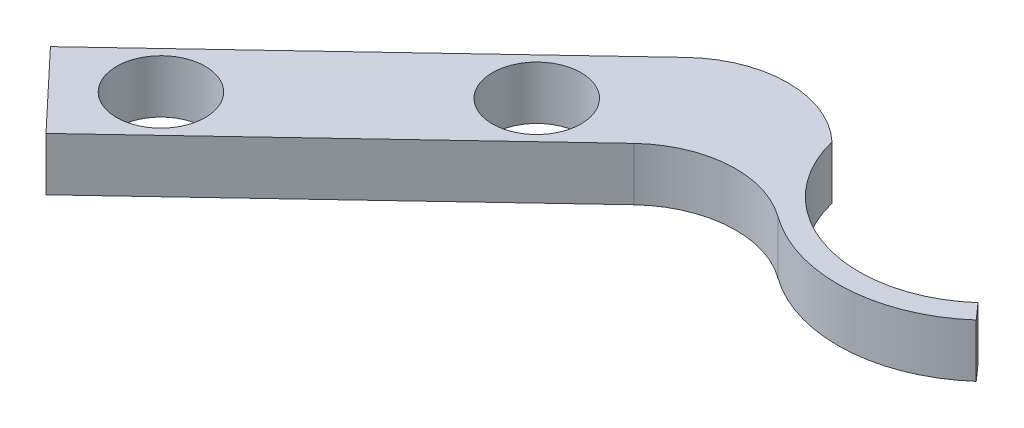
ISO-10303-21;
HEADER;
FILE_DESCRIPTION(('STEP AP214'),'2;1');
FILE_NAME('part.step','',(''),(''),'','','');
FILE_SCHEMA(('AUTOMOTIVE_DESIGN { 1 0 10303 214 1 1 1 1 }'));
ENDSEC;
DATA;
#1=APPLICATION_CONTEXT('core data for automotive mechanical design processes');
#2=APPLICATION_PROTOCOL_DEFINITION('international standard','automotive_design',2000,#1);
#3=PRODUCT_CONTEXT('',#1,'mechanical');
#4=PRODUCT('Part','Part','',(#3));
#5=PRODUCT_RELATED_PRODUCT_CATEGORY('part','',(#4));
#6=PRODUCT_DEFINITION_FORMATION('','',#4);
#7=PRODUCT_DEFINITION_CONTEXT('part definition',#1,'design');
#8=PRODUCT_DEFINITION('design','',#6,#7);
#9=PRODUCT_DEFINITION_SHAPE('','',#8);
#10=(LENGTH_UNIT() NAMED_UNIT(*) SI_UNIT(.MILLI.,.METRE.));
#11=(NAMED_UNIT(*) PLANE_ANGLE_UNIT() SI_UNIT($,.RADIAN.));
#12=(NAMED_UNIT(*) SI_UNIT($,.STERADIAN.) SOLID_ANGLE_UNIT());
#13=UNCERTAINTY_MEASURE_WITH_UNIT(LENGTH_MEASURE(1.E-05),#10,'distance_accuracy_value','');
#14=(GEOMETRIC_REPRESENTATION_CONTEXT(3) GLOBAL_UNCERTAINTY_ASSIGNED_CONTEXT((#13)) GLOBAL_UNIT_ASSIGNED_CONTEXT((#10,
#11,#12)) REPRESENTATION_CONTEXT('',''));
#15=CARTESIAN_POINT('',(0.,0.,0.));
#16=DIRECTION('',(0.,0.,1.));
#17=DIRECTION('',(1.,0.,0.));
#18=AXIS2_PLACEMENT_3D('',#15,#16,#17);
#19=CARTESIAN_POINT('',(-18.1068328298578,5.,17.0745135447983));
#20=DIRECTION('',(0.727542136032065,0.,-0.686063000239702));
#21=DIRECTION('',(-0.686063000239702,0.,-0.727542136032065));
#22=AXIS2_PLACEMENT_3D('',#19,#20,#21);
#23=PLANE('',#22);
#24=DIRECTION('',(0.686063000239702,0.,0.727542136032065));
#25=VECTOR('',#24,1.);
#26=CARTESIAN_POINT('',(-18.1068328298578,5.,17.0745135447983));
#27=LINE('',#26,#25);
#28=CARTESIAN_POINT('',(-14.6765178286592,5.,20.7122242249587));
#29=VERTEX_POINT('',#28);
#30=CARTESIAN_POINT('',(-7.8158878262622,5.,27.9876455852793));
#31=VERTEX_POINT('',#30);
#32=EDGE_CURVE('E125',#29,#31,#27,.T.);
#33=ORIENTED_EDGE('',*,*,#32,.F.);
#34=DIRECTION('',(0.,1.,0.));
#35=VECTOR('',#34,1.);
#36=CARTESIAN_POINT('',(-14.6765178286592,0.,20.7122242249587));
#37=LINE('',#36,#35);
#38=CARTESIAN_POINT('',(-14.6765178286592,0.,20.7122242249587));
#39=VERTEX_POINT('',#38);
#40=EDGE_CURVE('E110',#39,#29,#37,.T.);
#41=ORIENTED_EDGE('',*,*,#40,.F.);
#42=DIRECTION('',(0.686063000239702,0.,0.727542136032065));
#43=VECTOR('',#42,1.);
#44=CARTESIAN_POINT('',(-18.1068328298578,0.,17.0745135447983));
#45=LINE('',#44,#43);
#46=CARTESIAN_POINT('',(-7.8158878262622,0.,27.9876455852793));
#47=VERTEX_POINT('',#46);
#48=EDGE_CURVE('E122',#39,#47,#45,.T.);
#49=ORIENTED_EDGE('',*,*,#48,.T.);
#50=DIRECTION('',(0.,-1.,0.));
#51=VECTOR('',#50,1.);
#52=CARTESIAN_POINT('',(-7.8158878262622,5.,27.9876455852793));
#53=LINE('',#52,#51);
#54=EDGE_CURVE('E133',#31,#47,#53,.T.);
#55=ORIENTED_EDGE('',*,*,#54,.F.);
#56=EDGE_LOOP('',(#33,#41,#49,#55));
#57=FACE_BOUND('',#56,.T.);
#58=ADVANCED_FACE('F41',(#57),#23,.F.);
#59=CARTESIAN_POINT('',(0.,5.,0.));
#60=DIRECTION('',(0.,1.,0.));
#61=DIRECTION('',(0.,0.,1.));
#62=AXIS2_PLACEMENT_3D('',#59,#60,#61);
#63=PLANE('',#62);
#64=CARTESIAN_POINT('',(41.6849024656537,5.,-11.1706048980363));
#65=DIRECTION('',(0.,-1.,0.));
#66=DIRECTION('',(-0.998279481293919,0.,-0.0586351194041914));
#67=AXIS2_PLACEMENT_3D('',#64,#65,#66);
#68=CIRCLE('',#67,12.1999999999932);
#69=CARTESIAN_POINT('',(49.7909350480435,5.,-2.05291682632269));
#70=VERTEX_POINT('',#69);
#71=CARTESIAN_POINT('',(29.8309378284776,5.,-8.28555335943157));
#72=VERTEX_POINT('',#71);
#73=EDGE_CURVE('E182',#70,#72,#68,.T.);
#74=ORIENTED_EDGE('',*,*,#73,.T.);
#75=CARTESIAN_POINT('',(22.9527180289293,5.,-1.02675921790221));
#76=DIRECTION('',(0.,1.,0.));
#77=DIRECTION('',(0.,0.,1.));
#78=AXIS2_PLACEMENT_3D('',#75,#76,#77);
#79=CIRCLE('',#78,10.);
#80=CARTESIAN_POINT('',(16.0920880265322,5.,-8.30218057822283));
#81=VERTEX_POINT('',#80);
#82=EDGE_CURVE('E57',#72,#81,#79,.T.);
#83=ORIENTED_EDGE('',*,*,#82,.T.);
#84=DIRECTION('',(-0.727542136032062,0.,0.686063000239704));
#85=VECTOR('',#84,1.);
#86=CARTESIAN_POINT('',(3.43031500119851,5.,3.6377106801603));
#87=LINE('',#86,#85);
#88=EDGE_CURVE('E184',#81,#29,#87,.T.);
#89=ORIENTED_EDGE('',*,*,#88,.T.);
#90=ORIENTED_EDGE('',*,*,#32,.T.);
#91=DIRECTION('',(-0.727542136032062,0.,0.686063000239705));
#92=VECTOR('',#91,1.);
#93=CARTESIAN_POINT('',(10.2909450035955,5.,10.9131320404809));
#94=LINE('',#93,#92);
#95=CARTESIAN_POINT('',(20.6356951478936,5.,1.15816395102519));
#96=VERTEX_POINT('',#95);
#97=EDGE_CURVE('E173',#96,#31,#94,.T.);
#98=ORIENTED_EDGE('',*,*,#97,.F.);
#99=CARTESIAN_POINT('',(27.4963251502906,5.,8.43358531134581));
#100=DIRECTION('',(0.,1.,0.));
#101=DIRECTION('',(0.,0.,1.));
#102=AXIS2_PLACEMENT_3D('',#99,#100,#101);
#103=CIRCLE('',#102,10.);
#104=CARTESIAN_POINT('',(33.359373627715,5.,0.332680266144298));
#105=VERTEX_POINT('',#104);
#106=EDGE_CURVE('E11',#96,#105,#103,.F.);
#107=ORIENTED_EDGE('',*,*,#106,.T.);
#108=CARTESIAN_POINT('',(41.6849024656537,5.,-11.1706048980363));
#109=DIRECTION('',(0.,-1.,0.));
#110=DIRECTION('',(-0.998279481293919,0.,-0.0586351194041914));
#111=AXIS2_PLACEMENT_3D('',#108,#109,#110);
#112=CIRCLE('',#111,14.1999999999932);
#113=CARTESIAN_POINT('',(51.1197928484434,5.,-0.558213863736249));
#114=VERTEX_POINT('',#113);
#115=EDGE_CURVE('E172',#114,#105,#112,.T.);
#116=ORIENTED_EDGE('',*,*,#115,.F.);
#117=DIRECTION('',(-0.664428900195937,0.,-0.747351481288703));
#118=VECTOR('',#117,1.);
#119=CARTESIAN_POINT('',(35.4707727036347,5.,-18.1602753973189));
#120=LINE('',#119,#118);
#121=EDGE_CURVE('E178',#114,#70,#120,.T.);
#122=ORIENTED_EDGE('',*,*,#121,.T.);
#123=EDGE_LOOP('',(#74,#83,#89,#90,#98,#107,#116,#122));
#124=FACE_BOUND('',#123,.T.);
#125=CARTESIAN_POINT('',(12.3989165935813,5.,2.05288739732861));
#126=DIRECTION('',(0.,-1.,0.));
#127=DIRECTION('',(-0.998279481293919,0.,-0.0586351194041914));
#128=AXIS2_PLACEMENT_3D('',#125,#126,#127);
#129=CIRCLE('',#128,4.17500000000002);
#130=CARTESIAN_POINT('',(8.23109975917913,5.,1.8080857738161));
#131=VERTEX_POINT('',#130);
#132=EDGE_CURVE('E206',#131,#131,#129,.T.);
#133=ORIENTED_EDGE('',*,*,#132,.T.);
#134=EDGE_LOOP('',(#133));
#135=FACE_BOUND('',#134,.T.);
#136=CARTESIAN_POINT('',(-5.78963680722028,5.,19.2044624033212));
#137=DIRECTION('',(0.,-1.,0.));
#138=DIRECTION('',(-0.998279481293919,0.,-0.0586351194041914));
#139=AXIS2_PLACEMENT_3D('',#136,#137,#138);
#140=CIRCLE('',#139,4.17500000000002);
#141=CARTESIAN_POINT('',(-9.95745364162242,5.,18.9596607798087));
#142=VERTEX_POINT('',#141);
#143=EDGE_CURVE('E383',#142,#142,#140,.T.);
#144=ORIENTED_EDGE('',*,*,#143,.T.);
#145=EDGE_LOOP('',(#144));
#146=FACE_BOUND('',#145,.T.);
#147=ADVANCED_FACE('F170',(#124,#135,#146),#63,.T.);
#148=CARTESIAN_POINT('',(0.,0.,0.));
#149=DIRECTION('',(0.,1.,0.));
#150=DIRECTION('',(0.,0.,1.));
#151=AXIS2_PLACEMENT_3D('',#148,#149,#150);
#152=PLANE('',#151);
#153=DIRECTION('',(-0.727542136032062,0.,0.686063000239704));
#154=VECTOR('',#153,1.);
#155=CARTESIAN_POINT('',(3.43031500119851,0.,3.6377106801603));
#156=LINE('',#155,#154);
#157=CARTESIAN_POINT('',(16.0920880265322,0.,-8.30218057822283));
#158=VERTEX_POINT('',#157);
#159=EDGE_CURVE('E107',#158,#39,#156,.T.);
#160=ORIENTED_EDGE('',*,*,#159,.F.);
#161=CARTESIAN_POINT('',(22.9527180289293,0.,-1.02675921790221));
#162=DIRECTION('',(0.,1.,0.));
#163=DIRECTION('',(0.,0.,1.));
#164=AXIS2_PLACEMENT_3D('',#161,#162,#163);
#165=CIRCLE('',#164,10.);
#166=CARTESIAN_POINT('',(29.8309378284776,0.,-8.28555335943157));
#167=VERTEX_POINT('',#166);
#168=EDGE_CURVE('E65',#158,#167,#165,.F.);
#169=ORIENTED_EDGE('',*,*,#168,.T.);
#170=CARTESIAN_POINT('',(41.6849024656537,0.,-11.1706048980363));
#171=DIRECTION('',(0.,-1.,0.));
#172=DIRECTION('',(-0.998279481293919,0.,-0.0586351194041914));
#173=AXIS2_PLACEMENT_3D('',#170,#171,#172);
#174=CIRCLE('',#173,12.1999999999932);
#175=CARTESIAN_POINT('',(49.7909350480435,0.,-2.05291682632269));
#176=VERTEX_POINT('',#175);
#177=EDGE_CURVE('E202',#176,#167,#174,.T.);
#178=ORIENTED_EDGE('',*,*,#177,.F.);
#179=DIRECTION('',(-0.664428900195937,0.,-0.747351481288703));
#180=VECTOR('',#179,1.);
#181=CARTESIAN_POINT('',(35.4707727036347,0.,-18.1602753973189));
#182=LINE('',#181,#180);
#183=CARTESIAN_POINT('',(51.1197928484434,0.,-0.558213863736249));
#184=VERTEX_POINT('',#183);
#185=EDGE_CURVE('E199',#184,#176,#182,.T.);
#186=ORIENTED_EDGE('',*,*,#185,.F.);
#187=CARTESIAN_POINT('',(41.6849024656537,0.,-11.1706048980363));
#188=DIRECTION('',(0.,-1.,0.));
#189=DIRECTION('',(-0.998279481293919,0.,-0.0586351194041914));
#190=AXIS2_PLACEMENT_3D('',#187,#188,#189);
#191=CIRCLE('',#190,14.1999999999932);
#192=CARTESIAN_POINT('',(33.359373627715,0.,0.332680266144298));
#193=VERTEX_POINT('',#192);
#194=EDGE_CURVE('E157',#184,#193,#191,.T.);
#195=ORIENTED_EDGE('',*,*,#194,.T.);
#196=CARTESIAN_POINT('',(27.4963251502906,0.,8.43358531134581));
#197=DIRECTION('',(0.,1.,0.));
#198=DIRECTION('',(0.,0.,1.));
#199=AXIS2_PLACEMENT_3D('',#196,#197,#198);
#200=CIRCLE('',#199,10.);
#201=CARTESIAN_POINT('',(20.6356951478936,0.,1.15816395102519));
#202=VERTEX_POINT('',#201);
#203=EDGE_CURVE('E50',#193,#202,#200,.T.);
#204=ORIENTED_EDGE('',*,*,#203,.T.);
#205=DIRECTION('',(-0.727542136032062,0.,0.686063000239705));
#206=VECTOR('',#205,1.);
#207=CARTESIAN_POINT('',(10.2909450035955,0.,10.9131320404809));
#208=LINE('',#207,#206);
#209=EDGE_CURVE('E116',#202,#47,#208,.T.);
#210=ORIENTED_EDGE('',*,*,#209,.T.);
#211=ORIENTED_EDGE('',*,*,#48,.F.);
#212=EDGE_LOOP('',(#160,#169,#178,#186,#195,#204,#210,#211));
#213=FACE_BOUND('',#212,.T.);
#214=CARTESIAN_POINT('',(12.3989165935813,0.,2.05288739732861));
#215=DIRECTION('',(0.,-1.,0.));
#216=DIRECTION('',(-0.998279481293919,0.,-0.0586351194041914));
#217=AXIS2_PLACEMENT_3D('',#214,#215,#216);
#218=CIRCLE('',#217,4.17500000000002);
#219=CARTESIAN_POINT('',(8.23109975917913,0.,1.8080857738161));
#220=VERTEX_POINT('',#219);
#221=EDGE_CURVE('E127',#220,#220,#218,.T.);
#222=ORIENTED_EDGE('',*,*,#221,.F.);
#223=EDGE_LOOP('',(#222));
#224=FACE_BOUND('',#223,.T.);
#225=CARTESIAN_POINT('',(-5.78963680722028,0.,19.2044624033212));
#226=DIRECTION('',(0.,-1.,0.));
#227=DIRECTION('',(-0.998279481293919,0.,-0.0586351194041914));
#228=AXIS2_PLACEMENT_3D('',#225,#226,#227);
#229=CIRCLE('',#228,4.17500000000002);
#230=CARTESIAN_POINT('',(-9.95745364162242,0.,18.9596607798087));
#231=VERTEX_POINT('',#230);
#232=EDGE_CURVE('E117',#231,#231,#229,.T.);
#233=ORIENTED_EDGE('',*,*,#232,.F.);
#234=EDGE_LOOP('',(#233));
#235=FACE_BOUND('',#234,.T.);
#236=ADVANCED_FACE('F129',(#213,#224,#235),#152,.F.);
#237=CARTESIAN_POINT('',(3.43031500119851,5.,3.6377106801603));
#238=DIRECTION('',(0.686063000239704,0.,0.727542136032062));
#239=DIRECTION('',(0.727542136032062,0.,-0.686063000239704));
#240=AXIS2_PLACEMENT_3D('',#237,#238,#239);
#241=PLANE('',#240);
#242=ORIENTED_EDGE('',*,*,#88,.F.);
#243=DIRECTION('',(0.,-1.,0.));
#244=VECTOR('',#243,1.);
#245=CARTESIAN_POINT('',(16.0920880265322,5.,-8.30218057822283));
#246=LINE('',#245,#244);
#247=EDGE_CURVE('E112',#81,#158,#246,.T.);
#248=ORIENTED_EDGE('',*,*,#247,.T.);
#249=ORIENTED_EDGE('',*,*,#159,.T.);
#250=ORIENTED_EDGE('',*,*,#40,.T.);
#251=EDGE_LOOP('',(#242,#248,#249,#250));
#252=FACE_BOUND('',#251,.T.);
#253=ADVANCED_FACE('F109',(#252),#241,.F.);
#254=CARTESIAN_POINT('',(10.2909450035955,5.,10.9131320404809));
#255=DIRECTION('',(0.686063000239705,0.,0.727542136032062));
#256=DIRECTION('',(0.727542136032062,0.,-0.686063000239705));
#257=AXIS2_PLACEMENT_3D('',#254,#255,#256);
#258=PLANE('',#257);
#259=ORIENTED_EDGE('',*,*,#209,.F.);
#260=DIRECTION('',(0.,1.,0.));
#261=VECTOR('',#260,1.);
#262=CARTESIAN_POINT('',(20.6356951478936,5.,1.15816395102519));
#263=LINE('',#262,#261);
#264=EDGE_CURVE('E145',#202,#96,#263,.T.);
#265=ORIENTED_EDGE('',*,*,#264,.T.);
#266=ORIENTED_EDGE('',*,*,#97,.T.);
#267=ORIENTED_EDGE('',*,*,#54,.T.);
#268=EDGE_LOOP('',(#259,#265,#266,#267));
#269=FACE_BOUND('',#268,.T.);
#270=ADVANCED_FACE('F162',(#269),#258,.T.);
#271=CARTESIAN_POINT('',(41.6849024656537,5.,-11.1706048980363));
#272=DIRECTION('',(0.,-1.,0.));
#273=DIRECTION('',(0.,0.,-1.));
#274=AXIS2_PLACEMENT_3D('',#271,#272,#273);
#275=CYLINDRICAL_SURFACE('',#274,14.1999999999932);
#276=ORIENTED_EDGE('',*,*,#115,.T.);
#277=DIRECTION('',(0.,-1.,0.));
#278=VECTOR('',#277,1.);
#279=CARTESIAN_POINT('',(33.359373627715,5.,0.332680266144299));
#280=LINE('',#279,#278);
#281=EDGE_CURVE('E137',#105,#193,#280,.T.);
#282=ORIENTED_EDGE('',*,*,#281,.T.);
#283=ORIENTED_EDGE('',*,*,#194,.F.);
#284=DIRECTION('',(0.,-1.,0.));
#285=VECTOR('',#284,1.);
#286=CARTESIAN_POINT('',(51.1197928484434,5.,-0.558213863736249));
#287=LINE('',#286,#285);
#288=EDGE_CURVE('E139',#114,#184,#287,.T.);
#289=ORIENTED_EDGE('',*,*,#288,.F.);
#290=EDGE_LOOP('',(#276,#282,#283,#289));
#291=FACE_BOUND('',#290,.T.);
#292=ADVANCED_FACE('F175',(#291),#275,.T.);
#293=CARTESIAN_POINT('',(35.4707727036347,5.,-18.1602753973189));
#294=DIRECTION('',(-0.747351481288703,0.,0.664428900195937));
#295=DIRECTION('',(0.664428900195937,0.,0.747351481288703));
#296=AXIS2_PLACEMENT_3D('',#293,#294,#295);
#297=PLANE('',#296);
#298=ORIENTED_EDGE('',*,*,#185,.T.);
#299=DIRECTION('',(0.,-1.,0.));
#300=VECTOR('',#299,1.);
#301=CARTESIAN_POINT('',(49.7909350480435,5.,-2.05291682632269));
#302=LINE('',#301,#300);
#303=EDGE_CURVE('E209',#70,#176,#302,.T.);
#304=ORIENTED_EDGE('',*,*,#303,.F.);
#305=ORIENTED_EDGE('',*,*,#121,.F.);
#306=ORIENTED_EDGE('',*,*,#288,.T.);
#307=EDGE_LOOP('',(#298,#304,#305,#306));
#308=FACE_BOUND('',#307,.T.);
#309=ADVANCED_FACE('F215',(#308),#297,.F.);
#310=CARTESIAN_POINT('',(41.6849024656537,5.,-11.1706048980363));
#311=DIRECTION('',(0.,-1.,0.));
#312=DIRECTION('',(0.,0.,-1.));
#313=AXIS2_PLACEMENT_3D('',#310,#311,#312);
#314=CYLINDRICAL_SURFACE('',#313,12.1999999999932);
#315=ORIENTED_EDGE('',*,*,#177,.T.);
#316=DIRECTION('',(0.,-1.,0.));
#317=VECTOR('',#316,1.);
#318=CARTESIAN_POINT('',(29.8309378284776,5.,-8.28555335943157));
#319=LINE('',#318,#317);
#320=EDGE_CURVE('E190',#72,#167,#319,.T.);
#321=ORIENTED_EDGE('',*,*,#320,.F.);
#322=ORIENTED_EDGE('',*,*,#73,.F.);
#323=ORIENTED_EDGE('',*,*,#303,.T.);
#324=EDGE_LOOP('',(#315,#321,#322,#323));
#325=FACE_BOUND('',#324,.T.);
#326=ADVANCED_FACE('F220',(#325),#314,.F.);
#327=CARTESIAN_POINT('',(-5.78963680722028,5.,19.2044624033212));
#328=DIRECTION('',(0.,-1.,0.));
#329=DIRECTION('',(0.,0.,-1.));
#330=AXIS2_PLACEMENT_3D('',#327,#328,#329);
#331=CYLINDRICAL_SURFACE('',#330,4.17500000000002);
#332=ORIENTED_EDGE('',*,*,#143,.F.);
#333=EDGE_LOOP('',(#332));
#334=FACE_BOUND('',#333,.T.);
#335=ORIENTED_EDGE('',*,*,#232,.T.);
#336=EDGE_LOOP('',(#335));
#337=FACE_BOUND('',#336,.T.);
#338=ADVANCED_FACE('F238',(#334,#337),#331,.F.);
#339=CARTESIAN_POINT('',(12.3989165935813,5.,2.05288739732861));
#340=DIRECTION('',(0.,-1.,0.));
#341=DIRECTION('',(0.,0.,-1.));
#342=AXIS2_PLACEMENT_3D('',#339,#340,#341);
#343=CYLINDRICAL_SURFACE('',#342,4.17500000000002);
#344=ORIENTED_EDGE('',*,*,#132,.F.);
#345=EDGE_LOOP('',(#344));
#346=FACE_BOUND('',#345,.T.);
#347=ORIENTED_EDGE('',*,*,#221,.T.);
#348=EDGE_LOOP('',(#347));
#349=FACE_BOUND('',#348,.T.);
#350=ADVANCED_FACE('F226',(#346,#349),#343,.F.);
#351=CARTESIAN_POINT('',(27.4963251502906,5.,8.43358531134581));
#352=DIRECTION('',(0.,-1.,0.));
#353=DIRECTION('',(0.,0.,-1.));
#354=AXIS2_PLACEMENT_3D('',#351,#352,#353);
#355=CYLINDRICAL_SURFACE('',#354,10.);
#356=ORIENTED_EDGE('',*,*,#106,.F.);
#357=ORIENTED_EDGE('',*,*,#264,.F.);
#358=ORIENTED_EDGE('',*,*,#203,.F.);
#359=ORIENTED_EDGE('',*,*,#281,.F.);
#360=EDGE_LOOP('',(#356,#357,#358,#359));
#361=FACE_BOUND('',#360,.T.);
#362=ADVANCED_FACE('F167',(#361),#355,.F.);
#363=CARTESIAN_POINT('',(22.9527180289293,5.,-1.02675921790221));
#364=DIRECTION('',(0.,-1.,0.));
#365=DIRECTION('',(0.,0.,-1.));
#366=AXIS2_PLACEMENT_3D('',#363,#364,#365);
#367=CYLINDRICAL_SURFACE('',#366,10.);
#368=ORIENTED_EDGE('',*,*,#82,.F.);
#369=ORIENTED_EDGE('',*,*,#320,.T.);
#370=ORIENTED_EDGE('',*,*,#168,.F.);
#371=ORIENTED_EDGE('',*,*,#247,.F.);
#372=EDGE_LOOP('',(#368,#369,#370,#371));
#373=FACE_BOUND('',#372,.T.);
#374=ADVANCED_FACE('F43',(#373),#367,.T.);
#375=CLOSED_SHELL('',(#58,#147,#236,#253,#270,#292,#309,#326,#338,#350,#362,#374));
#376=MANIFOLD_SOLID_BREP('B2',#375);
#377=ADVANCED_BREP_SHAPE_REPRESENTATION('',(#18,#376),#14);
#378=SHAPE_DEFINITION_REPRESENTATION(#9,#377);
ENDSEC;
END-ISO-10303-21;
